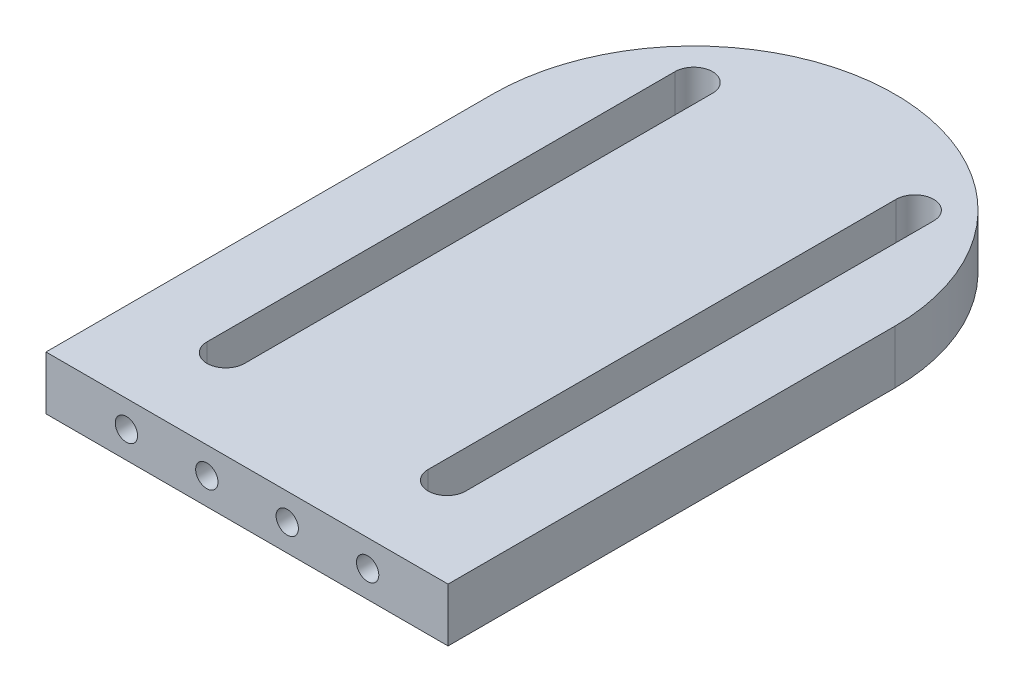
ISO-10303-21;
HEADER;
FILE_DESCRIPTION(('STEP AP214'),'2;1');
FILE_NAME('part.step','',(''),(''),'','','');
FILE_SCHEMA(('AUTOMOTIVE_DESIGN { 1 0 10303 214 1 1 1 1 }'));
ENDSEC;
DATA;
#1=APPLICATION_CONTEXT('core data for automotive mechanical design processes');
#2=APPLICATION_PROTOCOL_DEFINITION('international standard','automotive_design',2000,#1);
#3=PRODUCT_CONTEXT('',#1,'mechanical');
#4=PRODUCT('Part','Part','',(#3));
#5=PRODUCT_RELATED_PRODUCT_CATEGORY('part','',(#4));
#6=PRODUCT_DEFINITION_FORMATION('','',#4);
#7=PRODUCT_DEFINITION_CONTEXT('part definition',#1,'design');
#8=PRODUCT_DEFINITION('design','',#6,#7);
#9=PRODUCT_DEFINITION_SHAPE('','',#8);
#10=(LENGTH_UNIT() NAMED_UNIT(*) SI_UNIT(.MILLI.,.METRE.));
#11=(NAMED_UNIT(*) PLANE_ANGLE_UNIT() SI_UNIT($,.RADIAN.));
#12=(NAMED_UNIT(*) SI_UNIT($,.STERADIAN.) SOLID_ANGLE_UNIT());
#13=UNCERTAINTY_MEASURE_WITH_UNIT(LENGTH_MEASURE(1.E-05),#10,'distance_accuracy_value','');
#14=(GEOMETRIC_REPRESENTATION_CONTEXT(3) GLOBAL_UNCERTAINTY_ASSIGNED_CONTEXT((#13)) GLOBAL_UNIT_ASSIGNED_CONTEXT((#10,
#11,#12)) REPRESENTATION_CONTEXT('',''));
#15=CARTESIAN_POINT('',(0.,0.,0.));
#16=DIRECTION('',(0.,0.,1.));
#17=DIRECTION('',(1.,0.,0.));
#18=AXIS2_PLACEMENT_3D('',#15,#16,#17);
#19=CARTESIAN_POINT('',(0.,6.,0.));
#20=DIRECTION('',(0.,-1.,0.));
#21=DIRECTION('',(0.,0.,-1.));
#22=AXIS2_PLACEMENT_3D('',#19,#20,#21);
#23=CYLINDRICAL_SURFACE('',#22,22.5);
#24=CARTESIAN_POINT('',(0.,0.,0.));
#25=DIRECTION('',(0.,1.,0.));
#26=DIRECTION('',(0.,0.,1.));
#27=AXIS2_PLACEMENT_3D('',#24,#25,#26);
#28=CIRCLE('',#27,22.5);
#29=CARTESIAN_POINT('',(22.5,0.,0.));
#30=VERTEX_POINT('',#29);
#31=CARTESIAN_POINT('',(-22.5,0.,0.));
#32=VERTEX_POINT('',#31);
#33=EDGE_CURVE('E192',#30,#32,#28,.T.);
#34=ORIENTED_EDGE('',*,*,#33,.T.);
#35=DIRECTION('',(0.,-1.,0.));
#36=VECTOR('',#35,1.);
#37=CARTESIAN_POINT('',(-22.5,6.,0.));
#38=LINE('',#37,#36);
#39=CARTESIAN_POINT('',(-22.5,6.,0.));
#40=VERTEX_POINT('',#39);
#41=EDGE_CURVE('E225',#40,#32,#38,.T.);
#42=ORIENTED_EDGE('',*,*,#41,.F.);
#43=CARTESIAN_POINT('',(0.,6.,0.));
#44=DIRECTION('',(0.,1.,0.));
#45=DIRECTION('',(0.,0.,1.));
#46=AXIS2_PLACEMENT_3D('',#43,#44,#45);
#47=CIRCLE('',#46,22.5);
#48=CARTESIAN_POINT('',(22.5,6.,0.));
#49=VERTEX_POINT('',#48);
#50=EDGE_CURVE('E199',#49,#40,#47,.T.);
#51=ORIENTED_EDGE('',*,*,#50,.F.);
#52=DIRECTION('',(0.,-1.,0.));
#53=VECTOR('',#52,1.);
#54=CARTESIAN_POINT('',(22.5,6.,0.));
#55=LINE('',#54,#53);
#56=EDGE_CURVE('E209',#49,#30,#55,.T.);
#57=ORIENTED_EDGE('',*,*,#56,.T.);
#58=EDGE_LOOP('',(#34,#42,#51,#57));
#59=FACE_BOUND('',#58,.T.);
#60=ADVANCED_FACE('F41',(#59),#23,.T.);
#61=CARTESIAN_POINT('',(-22.5,6.,0.));
#62=DIRECTION('',(1.,0.,0.));
#63=DIRECTION('',(0.,0.,-1.));
#64=AXIS2_PLACEMENT_3D('',#61,#62,#63);
#65=PLANE('',#64);
#66=DIRECTION('',(0.,0.,1.));
#67=VECTOR('',#66,1.);
#68=CARTESIAN_POINT('',(-22.5,0.,0.));
#69=LINE('',#68,#67);
#70=CARTESIAN_POINT('',(-22.5,0.,50.));
#71=VERTEX_POINT('',#70);
#72=EDGE_CURVE('E212',#32,#71,#69,.T.);
#73=ORIENTED_EDGE('',*,*,#72,.T.);
#74=DIRECTION('',(0.,-1.,0.));
#75=VECTOR('',#74,1.);
#76=CARTESIAN_POINT('',(-22.5,6.,50.));
#77=LINE('',#76,#75);
#78=CARTESIAN_POINT('',(-22.5,6.,50.));
#79=VERTEX_POINT('',#78);
#80=EDGE_CURVE('E222',#79,#71,#77,.T.);
#81=ORIENTED_EDGE('',*,*,#80,.F.);
#82=DIRECTION('',(0.,0.,1.));
#83=VECTOR('',#82,1.);
#84=CARTESIAN_POINT('',(-22.5,6.,0.));
#85=LINE('',#84,#83);
#86=EDGE_CURVE('E202',#40,#79,#85,.T.);
#87=ORIENTED_EDGE('',*,*,#86,.F.);
#88=ORIENTED_EDGE('',*,*,#41,.T.);
#89=EDGE_LOOP('',(#73,#81,#87,#88));
#90=FACE_BOUND('',#89,.T.);
#91=ADVANCED_FACE('F269',(#90),#65,.F.);
#92=CARTESIAN_POINT('',(-22.5,6.,50.));
#93=DIRECTION('',(0.,0.,-1.));
#94=DIRECTION('',(-1.,0.,0.));
#95=AXIS2_PLACEMENT_3D('',#92,#93,#94);
#96=PLANE('',#95);
#97=CARTESIAN_POINT('',(-13.5,3.,50.));
#98=DIRECTION('',(0.,0.,1.));
#99=DIRECTION('',(1.,0.,0.));
#100=AXIS2_PLACEMENT_3D('',#97,#98,#99);
#101=CIRCLE('',#100,1.24999999999999);
#102=CARTESIAN_POINT('',(-12.25,3.,50.));
#103=VERTEX_POINT('',#102);
#104=EDGE_CURVE('E156',#103,#103,#101,.T.);
#105=ORIENTED_EDGE('',*,*,#104,.F.);
#106=EDGE_LOOP('',(#105));
#107=FACE_BOUND('',#106,.T.);
#108=CARTESIAN_POINT('',(-4.49999999999999,3.,50.));
#109=DIRECTION('',(0.,0.,1.));
#110=DIRECTION('',(1.,0.,0.));
#111=AXIS2_PLACEMENT_3D('',#108,#109,#110);
#112=CIRCLE('',#111,1.24999999999999);
#113=CARTESIAN_POINT('',(-3.25,3.,50.));
#114=VERTEX_POINT('',#113);
#115=EDGE_CURVE('E155',#114,#114,#112,.T.);
#116=ORIENTED_EDGE('',*,*,#115,.F.);
#117=EDGE_LOOP('',(#116));
#118=FACE_BOUND('',#117,.T.);
#119=CARTESIAN_POINT('',(4.5,3.,50.));
#120=DIRECTION('',(0.,0.,1.));
#121=DIRECTION('',(1.,0.,0.));
#122=AXIS2_PLACEMENT_3D('',#119,#120,#121);
#123=CIRCLE('',#122,1.24999999999999);
#124=CARTESIAN_POINT('',(5.74999999999999,3.,50.));
#125=VERTEX_POINT('',#124);
#126=EDGE_CURVE('E344',#125,#125,#123,.T.);
#127=ORIENTED_EDGE('',*,*,#126,.F.);
#128=EDGE_LOOP('',(#127));
#129=FACE_BOUND('',#128,.T.);
#130=CARTESIAN_POINT('',(13.5,3.,50.));
#131=DIRECTION('',(0.,0.,1.));
#132=DIRECTION('',(1.,0.,0.));
#133=AXIS2_PLACEMENT_3D('',#130,#131,#132);
#134=CIRCLE('',#133,1.24999999999999);
#135=CARTESIAN_POINT('',(14.75,3.,50.));
#136=VERTEX_POINT('',#135);
#137=EDGE_CURVE('E348',#136,#136,#134,.T.);
#138=ORIENTED_EDGE('',*,*,#137,.F.);
#139=EDGE_LOOP('',(#138));
#140=FACE_BOUND('',#139,.T.);
#141=DIRECTION('',(1.,0.,0.));
#142=VECTOR('',#141,1.);
#143=CARTESIAN_POINT('',(-22.5,0.,50.));
#144=LINE('',#143,#142);
#145=CARTESIAN_POINT('',(22.5,0.,50.));
#146=VERTEX_POINT('',#145);
#147=EDGE_CURVE('E214',#71,#146,#144,.T.);
#148=ORIENTED_EDGE('',*,*,#147,.T.);
#149=DIRECTION('',(0.,-1.,0.));
#150=VECTOR('',#149,1.);
#151=CARTESIAN_POINT('',(22.5,6.,50.));
#152=LINE('',#151,#150);
#153=CARTESIAN_POINT('',(22.5,6.,50.));
#154=VERTEX_POINT('',#153);
#155=EDGE_CURVE('E219',#154,#146,#152,.T.);
#156=ORIENTED_EDGE('',*,*,#155,.F.);
#157=DIRECTION('',(1.,0.,0.));
#158=VECTOR('',#157,1.);
#159=CARTESIAN_POINT('',(-22.5,6.,50.));
#160=LINE('',#159,#158);
#161=EDGE_CURVE('E205',#79,#154,#160,.T.);
#162=ORIENTED_EDGE('',*,*,#161,.F.);
#163=ORIENTED_EDGE('',*,*,#80,.T.);
#164=EDGE_LOOP('',(#148,#156,#162,#163));
#165=FACE_BOUND('',#164,.T.);
#166=ADVANCED_FACE('F274',(#107,#118,#129,#140,#165),#96,.F.);
#167=CARTESIAN_POINT('',(22.5,6.,0.));
#168=DIRECTION('',(-1.,0.,0.));
#169=DIRECTION('',(0.,0.,1.));
#170=AXIS2_PLACEMENT_3D('',#167,#168,#169);
#171=PLANE('',#170);
#172=DIRECTION('',(0.,0.,-1.));
#173=VECTOR('',#172,1.);
#174=CARTESIAN_POINT('',(22.5,0.,0.));
#175=LINE('',#174,#173);
#176=EDGE_CURVE('E203',#146,#30,#175,.T.);
#177=ORIENTED_EDGE('',*,*,#176,.T.);
#178=ORIENTED_EDGE('',*,*,#56,.F.);
#179=DIRECTION('',(0.,0.,-1.));
#180=VECTOR('',#179,1.);
#181=CARTESIAN_POINT('',(22.5,6.,0.));
#182=LINE('',#181,#180);
#183=EDGE_CURVE('E207',#154,#49,#182,.T.);
#184=ORIENTED_EDGE('',*,*,#183,.F.);
#185=ORIENTED_EDGE('',*,*,#155,.T.);
#186=EDGE_LOOP('',(#177,#178,#184,#185));
#187=FACE_BOUND('',#186,.T.);
#188=ADVANCED_FACE('F289',(#187),#171,.F.);
#189=CARTESIAN_POINT('',(0.,6.,0.));
#190=DIRECTION('',(0.,1.,0.));
#191=DIRECTION('',(0.,0.,1.));
#192=AXIS2_PLACEMENT_3D('',#189,#190,#191);
#193=PLANE('',#192);
#194=CARTESIAN_POINT('',(12.3743686707645,6.,-12.3743686707644));
#195=DIRECTION('',(0.,1.,0.));
#196=DIRECTION('',(0.,0.,-1.));
#197=AXIS2_PLACEMENT_3D('',#194,#195,#196);
#198=CIRCLE('',#197,2.1);
#199=CARTESIAN_POINT('',(14.4743686707645,6.,-12.3743686707646));
#200=VERTEX_POINT('',#199);
#201=CARTESIAN_POINT('',(10.2743686707645,6.,-12.3743686707646));
#202=VERTEX_POINT('',#201);
#203=EDGE_CURVE('E357',#200,#202,#198,.T.);
#204=ORIENTED_EDGE('',*,*,#203,.F.);
#205=DIRECTION('',(0.,0.,-1.));
#206=VECTOR('',#205,1.);
#207=CARTESIAN_POINT('',(14.4743686707645,6.,-12.3743686707646));
#208=LINE('',#207,#206);
#209=CARTESIAN_POINT('',(14.4743686707641,6.,40.0000000000001));
#210=VERTEX_POINT('',#209);
#211=EDGE_CURVE('E362',#210,#200,#208,.T.);
#212=ORIENTED_EDGE('',*,*,#211,.F.);
#213=CARTESIAN_POINT('',(12.3743686707641,6.,40.0000000000001));
#214=DIRECTION('',(0.,1.,0.));
#215=DIRECTION('',(0.,0.,-1.));
#216=AXIS2_PLACEMENT_3D('',#213,#214,#215);
#217=CIRCLE('',#216,2.1);
#218=CARTESIAN_POINT('',(10.2743686707641,6.,40.0000000000001));
#219=VERTEX_POINT('',#218);
#220=EDGE_CURVE('E376',#219,#210,#217,.T.);
#221=ORIENTED_EDGE('',*,*,#220,.F.);
#222=DIRECTION('',(0.,0.,1.));
#223=VECTOR('',#222,1.);
#224=CARTESIAN_POINT('',(10.2743686707645,6.,-12.3743686707646));
#225=LINE('',#224,#223);
#226=EDGE_CURVE('E373',#202,#219,#225,.T.);
#227=ORIENTED_EDGE('',*,*,#226,.F.);
#228=EDGE_LOOP('',(#204,#212,#221,#227));
#229=FACE_BOUND('',#228,.T.);
#230=CARTESIAN_POINT('',(-12.3743686707645,6.,-12.3743686707646));
#231=DIRECTION('',(0.,1.,0.));
#232=DIRECTION('',(0.,0.,1.));
#233=AXIS2_PLACEMENT_3D('',#230,#231,#232);
#234=CIRCLE('',#233,2.1);
#235=CARTESIAN_POINT('',(-10.2743686707645,6.,-12.3743686707646));
#236=VERTEX_POINT('',#235);
#237=CARTESIAN_POINT('',(-14.4743686707645,6.,-12.3743686707646));
#238=VERTEX_POINT('',#237);
#239=EDGE_CURVE('E181',#236,#238,#234,.T.);
#240=ORIENTED_EDGE('',*,*,#239,.F.);
#241=DIRECTION('',(0.,0.,-1.));
#242=VECTOR('',#241,1.);
#243=CARTESIAN_POINT('',(-10.2743686707645,6.,-12.3743686707646));
#244=LINE('',#243,#242);
#245=CARTESIAN_POINT('',(-10.2743686707645,6.,40.));
#246=VERTEX_POINT('',#245);
#247=EDGE_CURVE('E174',#246,#236,#244,.T.);
#248=ORIENTED_EDGE('',*,*,#247,.F.);
#249=CARTESIAN_POINT('',(-12.3743686707645,6.,40.));
#250=DIRECTION('',(0.,1.,0.));
#251=DIRECTION('',(0.,0.,1.));
#252=AXIS2_PLACEMENT_3D('',#249,#250,#251);
#253=CIRCLE('',#252,2.1);
#254=CARTESIAN_POINT('',(-14.4743686707645,6.,40.));
#255=VERTEX_POINT('',#254);
#256=EDGE_CURVE('E165',#255,#246,#253,.T.);
#257=ORIENTED_EDGE('',*,*,#256,.F.);
#258=DIRECTION('',(0.,0.,1.));
#259=VECTOR('',#258,1.);
#260=CARTESIAN_POINT('',(-14.4743686707645,6.,-12.3743686707646));
#261=LINE('',#260,#259);
#262=EDGE_CURVE('E175',#238,#255,#261,.T.);
#263=ORIENTED_EDGE('',*,*,#262,.F.);
#264=EDGE_LOOP('',(#240,#248,#257,#263));
#265=FACE_BOUND('',#264,.T.);
#266=ORIENTED_EDGE('',*,*,#50,.T.);
#267=ORIENTED_EDGE('',*,*,#86,.T.);
#268=ORIENTED_EDGE('',*,*,#161,.T.);
#269=ORIENTED_EDGE('',*,*,#183,.T.);
#270=EDGE_LOOP('',(#266,#267,#268,#269));
#271=FACE_BOUND('',#270,.T.);
#272=ADVANCED_FACE('F179',(#229,#265,#271),#193,.T.);
#273=CARTESIAN_POINT('',(0.,0.,0.));
#274=DIRECTION('',(0.,1.,0.));
#275=DIRECTION('',(0.,0.,1.));
#276=AXIS2_PLACEMENT_3D('',#273,#274,#275);
#277=PLANE('',#276);
#278=DIRECTION('',(0.,0.,-1.));
#279=VECTOR('',#278,1.);
#280=CARTESIAN_POINT('',(14.4743686707645,0.,-12.3743686707646));
#281=LINE('',#280,#279);
#282=CARTESIAN_POINT('',(14.4743686707641,0.,40.0000000000001));
#283=VERTEX_POINT('',#282);
#284=CARTESIAN_POINT('',(14.4743686707645,0.,-12.3743686707646));
#285=VERTEX_POINT('',#284);
#286=EDGE_CURVE('E368',#283,#285,#281,.T.);
#287=ORIENTED_EDGE('',*,*,#286,.T.);
#288=CARTESIAN_POINT('',(12.3743686707645,0.,-12.3743686707644));
#289=DIRECTION('',(0.,1.,0.));
#290=DIRECTION('',(0.,0.,-1.));
#291=AXIS2_PLACEMENT_3D('',#288,#289,#290);
#292=CIRCLE('',#291,2.1);
#293=CARTESIAN_POINT('',(10.2743686707645,0.,-12.3743686707646));
#294=VERTEX_POINT('',#293);
#295=EDGE_CURVE('E358',#285,#294,#292,.T.);
#296=ORIENTED_EDGE('',*,*,#295,.T.);
#297=DIRECTION('',(0.,0.,1.));
#298=VECTOR('',#297,1.);
#299=CARTESIAN_POINT('',(10.2743686707645,0.,-12.3743686707646));
#300=LINE('',#299,#298);
#301=CARTESIAN_POINT('',(10.2743686707641,0.,40.0000000000001));
#302=VERTEX_POINT('',#301);
#303=EDGE_CURVE('E361',#294,#302,#300,.T.);
#304=ORIENTED_EDGE('',*,*,#303,.T.);
#305=CARTESIAN_POINT('',(12.3743686707641,0.,40.0000000000001));
#306=DIRECTION('',(0.,1.,0.));
#307=DIRECTION('',(0.,0.,-1.));
#308=AXIS2_PLACEMENT_3D('',#305,#306,#307);
#309=CIRCLE('',#308,2.1);
#310=EDGE_CURVE('E365',#302,#283,#309,.T.);
#311=ORIENTED_EDGE('',*,*,#310,.T.);
#312=EDGE_LOOP('',(#287,#296,#304,#311));
#313=FACE_BOUND('',#312,.T.);
#314=DIRECTION('',(0.,0.,-1.));
#315=VECTOR('',#314,1.);
#316=CARTESIAN_POINT('',(-10.2743686707645,0.,-12.3743686707646));
#317=LINE('',#316,#315);
#318=CARTESIAN_POINT('',(-10.2743686707645,0.,40.));
#319=VERTEX_POINT('',#318);
#320=CARTESIAN_POINT('',(-10.2743686707645,0.,-12.3743686707646));
#321=VERTEX_POINT('',#320);
#322=EDGE_CURVE('E198',#319,#321,#317,.T.);
#323=ORIENTED_EDGE('',*,*,#322,.T.);
#324=CARTESIAN_POINT('',(-12.3743686707645,0.,-12.3743686707646));
#325=DIRECTION('',(0.,1.,0.));
#326=DIRECTION('',(0.,0.,1.));
#327=AXIS2_PLACEMENT_3D('',#324,#325,#326);
#328=CIRCLE('',#327,2.1);
#329=CARTESIAN_POINT('',(-14.4743686707645,0.,-12.3743686707646));
#330=VERTEX_POINT('',#329);
#331=EDGE_CURVE('E183',#321,#330,#328,.T.);
#332=ORIENTED_EDGE('',*,*,#331,.T.);
#333=DIRECTION('',(0.,0.,1.));
#334=VECTOR('',#333,1.);
#335=CARTESIAN_POINT('',(-14.4743686707645,0.,-12.3743686707646));
#336=LINE('',#335,#334);
#337=CARTESIAN_POINT('',(-14.4743686707645,0.,40.));
#338=VERTEX_POINT('',#337);
#339=EDGE_CURVE('E186',#330,#338,#336,.T.);
#340=ORIENTED_EDGE('',*,*,#339,.T.);
#341=CARTESIAN_POINT('',(-12.3743686707645,0.,40.));
#342=DIRECTION('',(0.,1.,0.));
#343=DIRECTION('',(0.,0.,1.));
#344=AXIS2_PLACEMENT_3D('',#341,#342,#343);
#345=CIRCLE('',#344,2.1);
#346=EDGE_CURVE('E390',#338,#319,#345,.T.);
#347=ORIENTED_EDGE('',*,*,#346,.T.);
#348=EDGE_LOOP('',(#323,#332,#340,#347));
#349=FACE_BOUND('',#348,.T.);
#350=ORIENTED_EDGE('',*,*,#33,.F.);
#351=ORIENTED_EDGE('',*,*,#176,.F.);
#352=ORIENTED_EDGE('',*,*,#147,.F.);
#353=ORIENTED_EDGE('',*,*,#72,.F.);
#354=EDGE_LOOP('',(#350,#351,#352,#353));
#355=FACE_BOUND('',#354,.T.);
#356=ADVANCED_FACE('F282',(#313,#349,#355),#277,.F.);
#357=CARTESIAN_POINT('',(-12.3743686707645,0.,-12.3743686707646));
#358=DIRECTION('',(0.,1.,0.));
#359=DIRECTION('',(0.,0.,1.));
#360=AXIS2_PLACEMENT_3D('',#357,#358,#359);
#361=CYLINDRICAL_SURFACE('',#360,2.1);
#362=ORIENTED_EDGE('',*,*,#239,.T.);
#363=DIRECTION('',(0.,1.,0.));
#364=VECTOR('',#363,1.);
#365=CARTESIAN_POINT('',(-14.4743686707645,0.,-12.3743686707646));
#366=LINE('',#365,#364);
#367=EDGE_CURVE('E195',#330,#238,#366,.T.);
#368=ORIENTED_EDGE('',*,*,#367,.F.);
#369=ORIENTED_EDGE('',*,*,#331,.F.);
#370=DIRECTION('',(0.,1.,0.));
#371=VECTOR('',#370,1.);
#372=CARTESIAN_POINT('',(-10.2743686707645,0.,-12.3743686707646));
#373=LINE('',#372,#371);
#374=EDGE_CURVE('E190',#321,#236,#373,.T.);
#375=ORIENTED_EDGE('',*,*,#374,.T.);
#376=EDGE_LOOP('',(#362,#368,#369,#375));
#377=FACE_BOUND('',#376,.T.);
#378=ADVANCED_FACE('F303',(#377),#361,.F.);
#379=CARTESIAN_POINT('',(-10.2743686707645,0.,-12.3743686707646));
#380=DIRECTION('',(1.,0.,0.));
#381=DIRECTION('',(0.,0.,-1.));
#382=AXIS2_PLACEMENT_3D('',#379,#380,#381);
#383=PLANE('',#382);
#384=ORIENTED_EDGE('',*,*,#247,.T.);
#385=ORIENTED_EDGE('',*,*,#374,.F.);
#386=ORIENTED_EDGE('',*,*,#322,.F.);
#387=DIRECTION('',(0.,1.,0.));
#388=VECTOR('',#387,1.);
#389=CARTESIAN_POINT('',(-10.2743686707645,0.,40.));
#390=LINE('',#389,#388);
#391=EDGE_CURVE('E167',#319,#246,#390,.T.);
#392=ORIENTED_EDGE('',*,*,#391,.T.);
#393=EDGE_LOOP('',(#384,#385,#386,#392));
#394=FACE_BOUND('',#393,.T.);
#395=ADVANCED_FACE('F162',(#394),#383,.F.);
#396=CARTESIAN_POINT('',(-12.3743686707645,0.,40.));
#397=DIRECTION('',(0.,1.,0.));
#398=DIRECTION('',(0.,0.,1.));
#399=AXIS2_PLACEMENT_3D('',#396,#397,#398);
#400=CYLINDRICAL_SURFACE('',#399,2.1);
#401=CARTESIAN_POINT('',(-13.7630392712504,4.34994474193897,41.5753075773785));
#402=CARTESIAN_POINT('',(-13.7825491887157,4.31697148699211,41.5581071681841));
#403=CARTESIAN_POINT('',(-13.8012798433773,4.2835240009148,41.5409533364279));
#404=CARTESIAN_POINT('',(-13.8372557840317,4.21574328057721,41.5068435520892));
#405=CARTESIAN_POINT('',(-13.8545011535279,4.18141009625245,41.4898875884289));
#406=CARTESIAN_POINT('',(-13.9042862572797,4.07682579451199,41.4393039884125));
#407=CARTESIAN_POINT('',(-13.9346829031932,4.00531810044302,41.4061332976062));
#408=CARTESIAN_POINT('',(-13.9912489898496,3.85584267672534,41.3407627684368));
#409=CARTESIAN_POINT('',(-14.0171627760296,3.7777290570981,41.3086759969096));
#410=CARTESIAN_POINT('',(-14.0626334985298,3.61793926776528,41.2494573913669));
#411=CARTESIAN_POINT('',(-14.0822052718031,3.53627192757248,41.2223140584991));
#412=CARTESIAN_POINT('',(-14.1055176513438,3.41307233703519,41.1888227828027));
#413=CARTESIAN_POINT('',(-14.1121704043685,3.37302449119286,41.1790463852305));
#414=CARTESIAN_POINT('',(-14.123584667453,3.29211966922241,41.1620446776884));
#415=CARTESIAN_POINT('',(-14.1283466761668,3.25126290942085,41.1548186951426));
#416=CARTESIAN_POINT('',(-14.1357191722453,3.16957091530579,41.1435427793587));
#417=CARTESIAN_POINT('',(-14.1383623854782,3.12874549007716,41.1394445853716));
#418=CARTESIAN_POINT('',(-14.1414764853709,3.04680912747966,41.134609503234));
#419=CARTESIAN_POINT('',(-14.141947535033,3.00569821176628,41.1338723628653));
#420=CARTESIAN_POINT('',(-14.1406874317823,2.92350201602812,41.1358341320371));
#421=CARTESIAN_POINT('',(-14.1389512833087,2.88241700547217,41.1385408360563));
#422=CARTESIAN_POINT('',(-14.1333698009556,2.80073256321159,41.1471445340932));
#423=CARTESIAN_POINT('',(-14.1295241298697,2.76013321019964,41.1530420381572));
#424=CARTESIAN_POINT('',(-14.1198314609551,2.67902733720929,41.1676629976166));
#425=CARTESIAN_POINT('',(-14.1139536542041,2.63853252779635,41.1764298385968));
#426=CARTESIAN_POINT('',(-14.1004165078046,2.55840401050301,41.196203542159));
#427=CARTESIAN_POINT('',(-14.0927568299421,2.51877046766176,41.2072108299471));
#428=CARTESIAN_POINT('',(-14.0677270851806,2.40279480486023,41.2423143743722));
#429=CARTESIAN_POINT('',(-14.048086600874,2.32767873649406,41.268843970433));
#430=CARTESIAN_POINT('',(-14.0034414108601,2.18048566495636,41.3256836963303));
#431=CARTESIAN_POINT('',(-13.978428716824,2.1084133808956,41.3559994276406));
#432=CARTESIAN_POINT('',(-13.9243851423825,1.97023275731148,41.4174107815469));
#433=CARTESIAN_POINT('',(-13.8955703226242,1.90400113359614,41.4484184416667));
#434=CARTESIAN_POINT('',(-13.8486765160029,1.80694072866208,41.4956293391891));
#435=CARTESIAN_POINT('',(-13.8324616981657,1.77501686930361,41.5114574242449));
#436=CARTESIAN_POINT('',(-13.7987370056348,1.71194254283151,41.543279307243));
#437=CARTESIAN_POINT('',(-13.7812270453159,1.68079212703437,41.5592731160815));
#438=CARTESIAN_POINT('',(-13.7630392712504,1.65005525806103,41.5753075773785));
#439=B_SPLINE_CURVE_WITH_KNOTS('',3,(#401,#402,#403,#404,#405,#406,#407,#408,#409,#410,#411,
#412,#413,#414,#415,#416,#417,#418,#419,#420,#421,#422,#423,#424,#425,#426,#427,#428,#429,#430,
#431,#432,#433,#434,#435,#436,#437,#438),.UNSPECIFIED.,.F.,.F.,(4,2,2,2,2,2,2,2,2,2,2,2,2,2,2,2,
2,2,4),(0.,0.125964925527263,0.251922764629027,0.505087677180355,0.769785638463978,
1.03385979917597,1.15903055478889,1.28416827663061,1.40733378621339,1.53049005313535,
1.65392555704069,1.77738079782557,1.90279635236945,2.02823573128825,2.27390557676905,
2.51994328743256,2.75552004907386,2.87293954033115,2.99036680144086),.UNSPECIFIED.);
#440=CARTESIAN_POINT('',(-13.8440625164344,4.20171585026776,41.5));
#441=VERTEX_POINT('',#440);
#442=CARTESIAN_POINT('',(-13.8440625164344,1.79828414973224,41.5));
#443=VERTEX_POINT('',#442);
#444=EDGE_CURVE('E53',#441,#443,#439,.T.);
#445=ORIENTED_EDGE('',*,*,#444,.T.);
#446=CARTESIAN_POINT('',(-13.8440625164344,1.79828414973224,41.5));
#447=CARTESIAN_POINT('',(-13.8157571661178,1.79018453597248,41.5277306035977));
#448=CARTESIAN_POINT('',(-13.7865555054315,1.78290294176262,41.5547724388038));
#449=CARTESIAN_POINT('',(-13.7263785779589,1.77028307982109,41.6073813198338));
#450=CARTESIAN_POINT('',(-13.6954007426602,1.76494771294265,41.6329461167885));
#451=CARTESIAN_POINT('',(-13.5996623540893,1.75231690586626,41.7073907026687));
#452=CARTESIAN_POINT('',(-13.5323649972335,1.74847926901667,41.753756462572));
#453=CARTESIAN_POINT('',(-13.4051562897294,1.75227255981828,41.8308522024801));
#454=CARTESIAN_POINT('',(-13.3459864479325,1.75803100549421,41.8628993552727));
#455=CARTESIAN_POINT('',(-13.2263236310176,1.77882437524809,41.9205623635786));
#456=CARTESIAN_POINT('',(-13.165835323367,1.79383050270893,41.9461978375623));
#457=CARTESIAN_POINT('',(-13.0453937677838,1.83386249394603,41.9909480823878));
#458=CARTESIAN_POINT('',(-12.9854442921244,1.85893441176094,42.0100321235368));
#459=CARTESIAN_POINT('',(-12.8688738508612,1.91903654191273,42.0418428871046));
#460=CARTESIAN_POINT('',(-12.8122558090996,1.95407534891049,42.0545640964886));
#461=CARTESIAN_POINT('',(-12.7080990554004,2.03081506003047,42.073948550916));
#462=CARTESIAN_POINT('',(-12.6602152194021,2.07196904982738,42.0809381534916));
#463=CARTESIAN_POINT('',(-12.5710327666008,2.16124960748348,42.0912535341592));
#464=CARTESIAN_POINT('',(-12.5297338757742,2.2093758850412,42.0945794647441));
#465=CARTESIAN_POINT('',(-12.4532594780605,2.31356909440914,42.0988829559044));
#466=CARTESIAN_POINT('',(-12.4184209457218,2.36988742581643,42.0997541207012));
#467=CARTESIAN_POINT('',(-12.3580611030462,2.48732303878903,42.1001542397196));
#468=CARTESIAN_POINT('',(-12.3325424843532,2.54844170053438,42.0996828065366));
#469=CARTESIAN_POINT('',(-12.2903619116035,2.67733035201568,42.098431986414));
#470=CARTESIAN_POINT('',(-12.2742510643606,2.74528128352322,42.0976373793378));
#471=CARTESIAN_POINT('',(-12.2535505614201,2.88291877219642,42.0965475735594));
#472=CARTESIAN_POINT('',(-12.2489612397643,2.95260537962509,42.0962523893369));
#473=CARTESIAN_POINT('',(-12.2514441839058,3.09242082380492,42.0963996671394));
#474=CARTESIAN_POINT('',(-12.2586252071478,3.16254775279585,42.0968490089691));
#475=CARTESIAN_POINT('',(-12.2846517660989,3.30060661679822,42.0981225100401));
#476=CARTESIAN_POINT('',(-12.3034988933461,3.36853825098773,42.0989467204184));
#477=CARTESIAN_POINT('',(-12.3523393086524,3.50031470885437,42.100025742771));
#478=CARTESIAN_POINT('',(-12.3823379755662,3.56415754288269,42.1002802795512));
#479=CARTESIAN_POINT('',(-12.4526267762439,3.68589140588287,42.0988344885812));
#480=CARTESIAN_POINT('',(-12.4929163842586,3.74378273869643,42.0971342606816));
#481=CARTESIAN_POINT('',(-12.5819940755916,3.85121914738899,42.0901812904511));
#482=CARTESIAN_POINT('',(-12.6306743330903,3.90085607316961,42.0849714392267));
#483=CARTESIAN_POINT('',(-12.7351100356232,3.99105811027147,42.0694542704984));
#484=CARTESIAN_POINT('',(-12.7908617614076,4.03162795967667,42.0591496244124));
#485=CARTESIAN_POINT('',(-12.9036956784639,4.10046852164056,42.0329692672872));
#486=CARTESIAN_POINT('',(-12.9605070022647,4.12932203901287,42.017456657505));
#487=CARTESIAN_POINT('',(-13.076028434311,4.17756678363274,41.9802396896276));
#488=CARTESIAN_POINT('',(-13.1347371834975,4.19696463021516,41.9585396798665));
#489=CARTESIAN_POINT('',(-13.2501157730424,4.22617318835665,41.9096806996746));
#490=CARTESIAN_POINT('',(-13.3067953806898,4.23624553274253,41.8826982249104));
#491=CARTESIAN_POINT('',(-13.4182180936412,4.24858493282704,41.8232878366837));
#492=CARTESIAN_POINT('',(-13.4729567508983,4.25083507938346,41.7908482851128));
#493=CARTESIAN_POINT('',(-13.583666481216,4.24852770810475,41.7182387256853));
#494=CARTESIAN_POINT('',(-13.6393461569924,4.2433746887969,41.6776458223857));
#495=CARTESIAN_POINT('',(-13.71907267948,4.2309461562203,41.6133615856135));
#496=CARTESIAN_POINT('',(-13.7449638226072,4.22603588337001,41.5914190539583));
#497=CARTESIAN_POINT('',(-13.7954717808124,4.21485111983264,41.5464816485503));
#498=CARTESIAN_POINT('',(-13.8200896178246,4.20857774486212,41.5234876475207));
#499=CARTESIAN_POINT('',(-13.8440625164344,4.20171585026776,41.5));
#500=B_SPLINE_CURVE_WITH_KNOTS('',3,(#446,#447,#448,#449,#450,#451,#452,#453,#454,#455,#456,
#457,#458,#459,#460,#461,#462,#463,#464,#465,#466,#467,#468,#469,#470,#471,#472,#473,#474,#475,
#476,#477,#478,#479,#480,#481,#482,#483,#484,#485,#486,#487,#488,#489,#490,#491,#492,#493,#494,
#495,#496,#497,#498,#499),.UNSPECIFIED.,.F.,.F.,(4,2,2,2,2,2,2,2,2,2,2,2,2,2,2,2,2,2,2,2,2,2,2,
2,2,2,4),(0.,0.121283378091882,0.24274679755131,0.486817572740174,0.688585223447205,
0.889727736876937,1.09180122144374,1.2940494892935,1.48377352487344,1.67348966328273,
1.8713107341264,2.06918889172269,2.27772578828448,2.48626873085189,2.69674948508627,
2.90725896030677,3.11787010509539,3.32847049221813,3.53654273106257,3.74450598429225,
3.9402442193749,4.13584523264474,4.32577567724853,4.51611643755708,4.72265185196248,
4.82547345793954,4.92821121803935),.UNSPECIFIED.);
#501=EDGE_CURVE('E11',#443,#441,#500,.T.);
#502=ORIENTED_EDGE('',*,*,#501,.T.);
#503=EDGE_LOOP('',(#445,#502));
#504=FACE_BOUND('',#503,.T.);
#505=ORIENTED_EDGE('',*,*,#256,.T.);
#506=ORIENTED_EDGE('',*,*,#391,.F.);
#507=ORIENTED_EDGE('',*,*,#346,.F.);
#508=DIRECTION('',(0.,1.,0.));
#509=VECTOR('',#508,1.);
#510=CARTESIAN_POINT('',(-14.4743686707645,0.,40.));
#511=LINE('',#510,#509);
#512=EDGE_CURVE('E170',#338,#255,#511,.T.);
#513=ORIENTED_EDGE('',*,*,#512,.T.);
#514=EDGE_LOOP('',(#505,#506,#507,#513));
#515=FACE_BOUND('',#514,.T.);
#516=ADVANCED_FACE('F158',(#504,#515),#400,.F.);
#517=CARTESIAN_POINT('',(-14.4743686707645,0.,-12.3743686707646));
#518=DIRECTION('',(-1.,0.,0.));
#519=DIRECTION('',(0.,0.,1.));
#520=AXIS2_PLACEMENT_3D('',#517,#518,#519);
#521=PLANE('',#520);
#522=ORIENTED_EDGE('',*,*,#262,.T.);
#523=ORIENTED_EDGE('',*,*,#512,.F.);
#524=ORIENTED_EDGE('',*,*,#339,.F.);
#525=ORIENTED_EDGE('',*,*,#367,.T.);
#526=EDGE_LOOP('',(#522,#523,#524,#525));
#527=FACE_BOUND('',#526,.T.);
#528=ADVANCED_FACE('F161',(#527),#521,.F.);
#529=CARTESIAN_POINT('',(12.3743686707645,0.,-12.3743686707644));
#530=DIRECTION('',(0.,1.,0.));
#531=DIRECTION('',(0.,0.,1.));
#532=AXIS2_PLACEMENT_3D('',#529,#530,#531);
#533=CYLINDRICAL_SURFACE('',#532,2.1);
#534=ORIENTED_EDGE('',*,*,#203,.T.);
#535=DIRECTION('',(0.,1.,0.));
#536=VECTOR('',#535,1.);
#537=CARTESIAN_POINT('',(10.2743686707645,0.,-12.3743686707646));
#538=LINE('',#537,#536);
#539=EDGE_CURVE('E371',#294,#202,#538,.T.);
#540=ORIENTED_EDGE('',*,*,#539,.F.);
#541=ORIENTED_EDGE('',*,*,#295,.F.);
#542=DIRECTION('',(0.,1.,0.));
#543=VECTOR('',#542,1.);
#544=CARTESIAN_POINT('',(14.4743686707645,0.,-12.3743686707646));
#545=LINE('',#544,#543);
#546=EDGE_CURVE('E380',#285,#200,#545,.T.);
#547=ORIENTED_EDGE('',*,*,#546,.T.);
#548=EDGE_LOOP('',(#534,#540,#541,#547));
#549=FACE_BOUND('',#548,.T.);
#550=ADVANCED_FACE('F258',(#549),#533,.F.);
#551=CARTESIAN_POINT('',(14.4743686707645,0.,-12.3743686707646));
#552=DIRECTION('',(1.,0.,0.));
#553=DIRECTION('',(0.,0.,-1.));
#554=AXIS2_PLACEMENT_3D('',#551,#552,#553);
#555=PLANE('',#554);
#556=ORIENTED_EDGE('',*,*,#211,.T.);
#557=ORIENTED_EDGE('',*,*,#546,.F.);
#558=ORIENTED_EDGE('',*,*,#286,.F.);
#559=DIRECTION('',(0.,1.,0.));
#560=VECTOR('',#559,1.);
#561=CARTESIAN_POINT('',(14.4743686707641,0.,40.0000000000001));
#562=LINE('',#561,#560);
#563=EDGE_CURVE('E382',#283,#210,#562,.T.);
#564=ORIENTED_EDGE('',*,*,#563,.T.);
#565=EDGE_LOOP('',(#556,#557,#558,#564));
#566=FACE_BOUND('',#565,.T.);
#567=ADVANCED_FACE('F256',(#566),#555,.F.);
#568=CARTESIAN_POINT('',(12.3743686707641,0.,40.0000000000001));
#569=DIRECTION('',(0.,1.,0.));
#570=DIRECTION('',(0.,0.,1.));
#571=AXIS2_PLACEMENT_3D('',#568,#569,#570);
#572=CYLINDRICAL_SURFACE('',#571,2.1);
#573=CARTESIAN_POINT('',(13.8440625164342,4.20171585026784,41.5));
#574=CARTESIAN_POINT('',(13.8157571661176,4.20981546402759,41.5277306035977));
#575=CARTESIAN_POINT('',(13.7865555054312,4.21709705823745,41.5547724388038));
#576=CARTESIAN_POINT('',(13.7263785779586,4.22971692017896,41.6073813198338));
#577=CARTESIAN_POINT('',(13.6954007426599,4.23505228705739,41.6329461167885));
#578=CARTESIAN_POINT('',(13.5996623540891,4.24768309413376,41.7073907026687));
#579=CARTESIAN_POINT('',(13.5323649972332,4.25152073098333,41.753756462572));
#580=CARTESIAN_POINT('',(13.4051562897291,4.2477274401817,41.8308522024801));
#581=CARTESIAN_POINT('',(13.3459864479323,4.24196899450576,41.8628993552727));
#582=CARTESIAN_POINT('',(13.2263236310174,4.22117562475186,41.9205623635787));
#583=CARTESIAN_POINT('',(13.1658353233668,4.206169497291,41.9461978375624));
#584=CARTESIAN_POINT('',(13.0453937677836,4.16613750605388,41.9909480823879));
#585=CARTESIAN_POINT('',(12.9854442921242,4.14106558823896,42.0100321235369));
#586=CARTESIAN_POINT('',(12.868873850861,4.08096345808715,42.0418428871046));
#587=CARTESIAN_POINT('',(12.8122558090994,4.04592465108938,42.0545640964887));
#588=CARTESIAN_POINT('',(12.7080990554003,3.96918493996938,42.0739485509161));
#589=CARTESIAN_POINT('',(12.6602152194019,3.92803095017245,42.0809381534916));
#590=CARTESIAN_POINT('',(12.5710327666006,3.83875039251633,42.0912535341593));
#591=CARTESIAN_POINT('',(12.5297338757741,3.79062411495861,42.0945794647442));
#592=CARTESIAN_POINT('',(12.4532594780603,3.68643090559065,42.0988829559045));
#593=CARTESIAN_POINT('',(12.4184209457217,3.63011257418335,42.0997541207013));
#594=CARTESIAN_POINT('',(12.3580611030461,3.51267696121074,42.1001542397197));
#595=CARTESIAN_POINT('',(12.3325424843531,3.45155829946538,42.0996828065367));
#596=CARTESIAN_POINT('',(12.2903619116035,3.32266964798408,42.0984319864141));
#597=CARTESIAN_POINT('',(12.2742510643605,3.25471871647653,42.0976373793379));
#598=CARTESIAN_POINT('',(12.2535505614201,3.11708122780332,42.0965475735595));
#599=CARTESIAN_POINT('',(12.2489612397643,3.04739462037465,42.096252389337));
#600=CARTESIAN_POINT('',(12.2514441839059,2.90757917619483,42.0963996671395));
#601=CARTESIAN_POINT('',(12.2586252071479,2.8374522472039,42.0968490089693));
#602=CARTESIAN_POINT('',(12.284651766099,2.69939338320153,42.0981225100402));
#603=CARTESIAN_POINT('',(12.3034988933462,2.63146174901203,42.0989467204185));
#604=CARTESIAN_POINT('',(12.3523393086525,2.4996852911454,42.1000257427711));
#605=CARTESIAN_POINT('',(12.3823379755663,2.43584245711708,42.1002802795513));
#606=CARTESIAN_POINT('',(12.452626776244,2.31410859411691,42.0988344885813));
#607=CARTESIAN_POINT('',(12.4929163842587,2.25621726130336,42.0971342606817));
#608=CARTESIAN_POINT('',(12.5819940755918,2.14878085261082,42.0901812904512));
#609=CARTESIAN_POINT('',(12.6306743330905,2.09914392683022,42.0849714392267));
#610=CARTESIAN_POINT('',(12.7351100356234,2.00894188972839,42.0694542704984));
#611=CARTESIAN_POINT('',(12.7908617614078,1.9683720403232,42.0591496244124));
#612=CARTESIAN_POINT('',(12.9036956784641,1.89953147835934,42.0329692672871));
#613=CARTESIAN_POINT('',(12.9605070022649,1.87067796098704,42.0174566575049));
#614=CARTESIAN_POINT('',(13.0760284343112,1.8224332163672,41.9802396896275));
#615=CARTESIAN_POINT('',(13.1347371834977,1.80303536978478,41.9585396798664));
#616=CARTESIAN_POINT('',(13.2501157730426,1.77382681164332,41.9096806996745));
#617=CARTESIAN_POINT('',(13.30679538069,1.76375446725745,41.8826982249102));
#618=CARTESIAN_POINT('',(13.4182180936413,1.75141506717295,41.8232878366835));
#619=CARTESIAN_POINT('',(13.4729567508985,1.74916492061654,41.7908482851126));
#620=CARTESIAN_POINT('',(13.5836664812161,1.75147229189526,41.7182387256851));
#621=CARTESIAN_POINT('',(13.6393461569924,1.7566253112031,41.6776458223856));
#622=CARTESIAN_POINT('',(13.7190726794799,1.76905384377968,41.6133615856133));
#623=CARTESIAN_POINT('',(13.7449638226071,1.77396411662996,41.5914190539582));
#624=CARTESIAN_POINT('',(13.7954717808122,1.78514888016731,41.5464816485502));
#625=CARTESIAN_POINT('',(13.8200896178243,1.79142225513782,41.5234876475207));
#626=CARTESIAN_POINT('',(13.8440625164342,1.79828414973216,41.5));
#627=B_SPLINE_CURVE_WITH_KNOTS('',3,(#573,#574,#575,#576,#577,#578,#579,#580,#581,#582,#583,
#584,#585,#586,#587,#588,#589,#590,#591,#592,#593,#594,#595,#596,#597,#598,#599,#600,#601,#602,
#603,#604,#605,#606,#607,#608,#609,#610,#611,#612,#613,#614,#615,#616,#617,#618,#619,#620,#621,
#622,#623,#624,#625,#626),.UNSPECIFIED.,.F.,.F.,(4,2,2,2,2,2,2,2,2,2,2,2,2,2,2,2,2,2,2,2,2,2,2,
2,2,2,4),(0.,0.121283378091891,0.242746797551314,0.486817572740177,0.688585223447213,
0.889727736876947,1.09180122144374,1.29404948929352,1.48377352487346,1.67348966328275,
1.87131073412643,2.06918889172271,2.27772578828451,2.48626873085192,2.6967494850863,
2.9072589603068,3.11787010509543,3.32847049221817,3.53654273106259,3.74450598429226,
3.9402442193749,4.13584523264472,4.32577567724853,4.51611643755708,4.72265185196225,
4.82547345793919,4.9282112180389),.UNSPECIFIED.);
#628=CARTESIAN_POINT('',(13.8440625164342,4.20171585026784,41.5));
#629=VERTEX_POINT('',#628);
#630=CARTESIAN_POINT('',(13.8440625164342,1.79828414973216,41.5));
#631=VERTEX_POINT('',#630);
#632=EDGE_CURVE('E228',#629,#631,#627,.T.);
#633=ORIENTED_EDGE('',*,*,#632,.T.);
#634=CARTESIAN_POINT('',(13.7630392712502,1.65005525806098,41.5753075773785));
#635=CARTESIAN_POINT('',(13.7825491887154,1.68302851300784,41.5581071681841));
#636=CARTESIAN_POINT('',(13.8012798433771,1.71647599908516,41.5409533364279));
#637=CARTESIAN_POINT('',(13.8372557840315,1.78425671942276,41.5068435520892));
#638=CARTESIAN_POINT('',(13.8545011535277,1.81858990374753,41.4898875884288));
#639=CARTESIAN_POINT('',(13.9042862572795,1.923174205488,41.4393039884125));
#640=CARTESIAN_POINT('',(13.934682903193,1.99468189955698,41.4061332976062));
#641=CARTESIAN_POINT('',(13.9912489898493,2.1441573232747,41.3407627684367));
#642=CARTESIAN_POINT('',(14.0171627760294,2.22227094290195,41.3086759969095));
#643=CARTESIAN_POINT('',(14.0626334985296,2.38206073223481,41.2494573913667));
#644=CARTESIAN_POINT('',(14.0822052718029,2.46372807242762,41.2223140584989));
#645=CARTESIAN_POINT('',(14.1055176513437,2.58692766296493,41.1888227828026));
#646=CARTESIAN_POINT('',(14.1121704043683,2.62697550880724,41.1790463852304));
#647=CARTESIAN_POINT('',(14.1235846674528,2.70788033077768,41.1620446776882));
#648=CARTESIAN_POINT('',(14.1283466761666,2.74873709057923,41.1548186951425));
#649=CARTESIAN_POINT('',(14.1357191722451,2.83042908469428,41.1435427793585));
#650=CARTESIAN_POINT('',(14.138362385478,2.87125450992291,41.1394445853715));
#651=CARTESIAN_POINT('',(14.1414764853707,2.95319087252039,41.1346095032339));
#652=CARTESIAN_POINT('',(14.1419475350328,2.99430178823376,41.1338723628652));
#653=CARTESIAN_POINT('',(14.1406874317821,3.07649798397191,41.1358341320369));
#654=CARTESIAN_POINT('',(14.1389512833085,3.11758299452786,41.1385408360562));
#655=CARTESIAN_POINT('',(14.1333698009554,3.19926743678843,41.1471445340931));
#656=CARTESIAN_POINT('',(14.1295241298695,3.23986678980037,41.1530420381571));
#657=CARTESIAN_POINT('',(14.1198314609549,3.32097266279071,41.1676629976165));
#658=CARTESIAN_POINT('',(14.1139536542039,3.36146747220364,41.1764298385966));
#659=CARTESIAN_POINT('',(14.1004165078044,3.44159598949696,41.1962035421589));
#660=CARTESIAN_POINT('',(14.0927568299418,3.48122953233821,41.207210829947));
#661=CARTESIAN_POINT('',(14.0677270851803,3.59720519513974,41.2423143743721));
#662=CARTESIAN_POINT('',(14.0480866008737,3.67232126350592,41.2688439704329));
#663=CARTESIAN_POINT('',(14.0034414108599,3.81951433504363,41.3256836963302));
#664=CARTESIAN_POINT('',(13.9784287168238,3.8915866191044,41.3559994276405));
#665=CARTESIAN_POINT('',(13.9243851423823,4.02976724268854,41.4174107815468));
#666=CARTESIAN_POINT('',(13.895570322624,4.09599886640388,41.4484184416666));
#667=CARTESIAN_POINT('',(13.8486765160026,4.19305927133796,41.4956293391891));
#668=CARTESIAN_POINT('',(13.8324616981655,4.22498313069643,41.5114574242449));
#669=CARTESIAN_POINT('',(13.7987370056346,4.28805745716853,41.543279307243));
#670=CARTESIAN_POINT('',(13.7812270453157,4.31920787296567,41.5592731160815));
#671=CARTESIAN_POINT('',(13.7630392712502,4.34994474193902,41.5753075773785));
#672=B_SPLINE_CURVE_WITH_KNOTS('',3,(#634,#635,#636,#637,#638,#639,#640,#641,#642,#643,#644,
#645,#646,#647,#648,#649,#650,#651,#652,#653,#654,#655,#656,#657,#658,#659,#660,#661,#662,#663,
#664,#665,#666,#667,#668,#669,#670,#671),.UNSPECIFIED.,.F.,.F.,(4,2,2,2,2,2,2,2,2,2,2,2,2,2,2,2,
2,2,4),(0.,0.125964925527282,0.251922764629072,0.505087677180449,0.769785638464133,
1.03385979917618,1.15903055478908,1.28416827663079,1.40733378621355,1.53049005313548,
1.65392555704081,1.77738079782567,1.90279635236952,2.02823573128831,2.27390557676914,
2.5199432874327,2.75552004907402,2.87293954033132,2.99036680144104),.UNSPECIFIED.);
#673=EDGE_CURVE('E152',#631,#629,#672,.T.);
#674=ORIENTED_EDGE('',*,*,#673,.T.);
#675=EDGE_LOOP('',(#633,#674));
#676=FACE_BOUND('',#675,.T.);
#677=ORIENTED_EDGE('',*,*,#220,.T.);
#678=ORIENTED_EDGE('',*,*,#563,.F.);
#679=ORIENTED_EDGE('',*,*,#310,.F.);
#680=DIRECTION('',(0.,1.,0.));
#681=VECTOR('',#680,1.);
#682=CARTESIAN_POINT('',(10.2743686707641,0.,40.0000000000001));
#683=LINE('',#682,#681);
#684=EDGE_CURVE('E384',#302,#219,#683,.T.);
#685=ORIENTED_EDGE('',*,*,#684,.T.);
#686=EDGE_LOOP('',(#677,#678,#679,#685));
#687=FACE_BOUND('',#686,.T.);
#688=ADVANCED_FACE('F240',(#676,#687),#572,.F.);
#689=CARTESIAN_POINT('',(10.2743686707645,0.,-12.3743686707646));
#690=DIRECTION('',(-1.,0.,0.));
#691=DIRECTION('',(0.,0.,1.));
#692=AXIS2_PLACEMENT_3D('',#689,#690,#691);
#693=PLANE('',#692);
#694=ORIENTED_EDGE('',*,*,#226,.T.);
#695=ORIENTED_EDGE('',*,*,#684,.F.);
#696=ORIENTED_EDGE('',*,*,#303,.F.);
#697=ORIENTED_EDGE('',*,*,#539,.T.);
#698=EDGE_LOOP('',(#694,#695,#696,#697));
#699=FACE_BOUND('',#698,.T.);
#700=ADVANCED_FACE('F254',(#699),#693,.F.);
#701=CARTESIAN_POINT('',(13.5,3.,41.5));
#702=DIRECTION('',(0.,0.,1.));
#703=DIRECTION('',(1.,0.,0.));
#704=AXIS2_PLACEMENT_3D('',#701,#702,#703);
#705=CONICAL_SURFACE('',#704,1.24999999999999,1.02974425867665);
#706=CARTESIAN_POINT('',(13.5,3.,41.5));
#707=DIRECTION('',(0.,0.,1.));
#708=DIRECTION('',(1.,0.,0.));
#709=AXIS2_PLACEMENT_3D('',#706,#707,#708);
#710=CIRCLE('',#709,1.24999999999999);
#711=EDGE_CURVE('E66',#631,#629,#710,.T.);
#712=ORIENTED_EDGE('',*,*,#711,.T.);
#713=ORIENTED_EDGE('',*,*,#673,.F.);
#714=EDGE_LOOP('',(#712,#713));
#715=FACE_BOUND('',#714,.T.);
#716=ADVANCED_FACE('F249',(#715),#705,.F.);
#717=CARTESIAN_POINT('',(13.5,3.,50.));
#718=DIRECTION('',(0.,0.,1.));
#719=DIRECTION('',(1.,0.,0.));
#720=AXIS2_PLACEMENT_3D('',#717,#718,#719);
#721=CYLINDRICAL_SURFACE('',#720,1.24999999999999);
#722=ORIENTED_EDGE('',*,*,#137,.T.);
#723=EDGE_LOOP('',(#722));
#724=FACE_BOUND('',#723,.T.);
#725=ORIENTED_EDGE('',*,*,#711,.F.);
#726=ORIENTED_EDGE('',*,*,#632,.F.);
#727=EDGE_LOOP('',(#725,#726));
#728=FACE_BOUND('',#727,.T.);
#729=ADVANCED_FACE('F244',(#724,#728),#721,.F.);
#730=CARTESIAN_POINT('',(4.5,3.,41.5));
#731=DIRECTION('',(0.,0.,1.));
#732=DIRECTION('',(1.,0.,0.));
#733=AXIS2_PLACEMENT_3D('',#730,#731,#732);
#734=CONICAL_SURFACE('',#733,1.24999999999999,1.02974425867665);
#735=CARTESIAN_POINT('',(4.5,3.,40.7489242262155));
#736=VERTEX_POINT('',#735);
#737=VERTEX_LOOP('',#736);
#738=FACE_BOUND('',#737,.T.);
#739=CARTESIAN_POINT('',(4.5,3.,41.5));
#740=DIRECTION('',(0.,0.,1.));
#741=DIRECTION('',(1.,0.,0.));
#742=AXIS2_PLACEMENT_3D('',#739,#740,#741);
#743=CIRCLE('',#742,1.24999999999999);
#744=CARTESIAN_POINT('',(5.74999999999999,3.,41.5));
#745=VERTEX_POINT('',#744);
#746=EDGE_CURVE('E341',#745,#745,#743,.T.);
#747=ORIENTED_EDGE('',*,*,#746,.T.);
#748=EDGE_LOOP('',(#747));
#749=FACE_BOUND('',#748,.T.);
#750=ADVANCED_FACE('F248',(#738,#749),#734,.F.);
#751=CARTESIAN_POINT('',(4.5,3.,50.));
#752=DIRECTION('',(0.,0.,1.));
#753=DIRECTION('',(1.,0.,0.));
#754=AXIS2_PLACEMENT_3D('',#751,#752,#753);
#755=CYLINDRICAL_SURFACE('',#754,1.24999999999999);
#756=ORIENTED_EDGE('',*,*,#746,.F.);
#757=EDGE_LOOP('',(#756));
#758=FACE_BOUND('',#757,.T.);
#759=ORIENTED_EDGE('',*,*,#126,.T.);
#760=EDGE_LOOP('',(#759));
#761=FACE_BOUND('',#760,.T.);
#762=ADVANCED_FACE('F330',(#758,#761),#755,.F.);
#763=CARTESIAN_POINT('',(-4.49999999999999,3.,41.5));
#764=DIRECTION('',(0.,0.,1.));
#765=DIRECTION('',(1.,0.,0.));
#766=AXIS2_PLACEMENT_3D('',#763,#764,#765);
#767=CONICAL_SURFACE('',#766,1.24999999999999,1.02974425867665);
#768=CARTESIAN_POINT('',(-4.5,3.,40.7489242262155));
#769=VERTEX_POINT('',#768);
#770=VERTEX_LOOP('',#769);
#771=FACE_BOUND('',#770,.T.);
#772=CARTESIAN_POINT('',(-4.49999999999999,3.,41.5));
#773=DIRECTION('',(0.,0.,1.));
#774=DIRECTION('',(1.,0.,0.));
#775=AXIS2_PLACEMENT_3D('',#772,#773,#774);
#776=CIRCLE('',#775,1.24999999999999);
#777=CARTESIAN_POINT('',(-3.25000000000001,3.,41.5));
#778=VERTEX_POINT('',#777);
#779=EDGE_CURVE('E346',#778,#778,#776,.T.);
#780=ORIENTED_EDGE('',*,*,#779,.T.);
#781=EDGE_LOOP('',(#780));
#782=FACE_BOUND('',#781,.T.);
#783=ADVANCED_FACE('F327',(#771,#782),#767,.F.);
#784=CARTESIAN_POINT('',(-4.49999999999999,3.,50.));
#785=DIRECTION('',(0.,0.,1.));
#786=DIRECTION('',(1.,0.,0.));
#787=AXIS2_PLACEMENT_3D('',#784,#785,#786);
#788=CYLINDRICAL_SURFACE('',#787,1.24999999999999);
#789=ORIENTED_EDGE('',*,*,#779,.F.);
#790=EDGE_LOOP('',(#789));
#791=FACE_BOUND('',#790,.T.);
#792=ORIENTED_EDGE('',*,*,#115,.T.);
#793=EDGE_LOOP('',(#792));
#794=FACE_BOUND('',#793,.T.);
#795=ADVANCED_FACE('F324',(#791,#794),#788,.F.);
#796=CARTESIAN_POINT('',(-13.5,3.,50.));
#797=DIRECTION('',(0.,0.,1.));
#798=DIRECTION('',(1.,0.,0.));
#799=AXIS2_PLACEMENT_3D('',#796,#797,#798);
#800=CYLINDRICAL_SURFACE('',#799,1.24999999999999);
#801=ORIENTED_EDGE('',*,*,#104,.T.);
#802=EDGE_LOOP('',(#801));
#803=FACE_BOUND('',#802,.T.);
#804=CARTESIAN_POINT('',(-13.5,3.,41.5));
#805=DIRECTION('',(0.,0.,1.));
#806=DIRECTION('',(1.,0.,0.));
#807=AXIS2_PLACEMENT_3D('',#804,#805,#806);
#808=CIRCLE('',#807,1.24999999999999);
#809=EDGE_CURVE('E59',#441,#443,#808,.T.);
#810=ORIENTED_EDGE('',*,*,#809,.F.);
#811=ORIENTED_EDGE('',*,*,#501,.F.);
#812=EDGE_LOOP('',(#810,#811));
#813=FACE_BOUND('',#812,.T.);
#814=ADVANCED_FACE('F154',(#803,#813),#800,.F.);
#815=CARTESIAN_POINT('',(-13.5,3.,41.5));
#816=DIRECTION('',(0.,0.,1.));
#817=DIRECTION('',(1.,0.,0.));
#818=AXIS2_PLACEMENT_3D('',#815,#816,#817);
#819=CONICAL_SURFACE('',#818,1.24999999999999,1.02974425867665);
#820=ORIENTED_EDGE('',*,*,#809,.T.);
#821=ORIENTED_EDGE('',*,*,#444,.F.);
#822=EDGE_LOOP('',(#820,#821));
#823=FACE_BOUND('',#822,.T.);
#824=ADVANCED_FACE('F150',(#823),#819,.F.);
#825=CLOSED_SHELL('',(#60,#91,#166,#188,#272,#356,#378,#395,#516,#528,#550,#567,#688,#700,#716,
#729,#750,#762,#783,#795,#814,#824));
#826=MANIFOLD_SOLID_BREP('B2',#825);
#827=ADVANCED_BREP_SHAPE_REPRESENTATION('',(#18,#826),#14);
#828=SHAPE_DEFINITION_REPRESENTATION(#9,#827);
ENDSEC;
END-ISO-10303-21;
